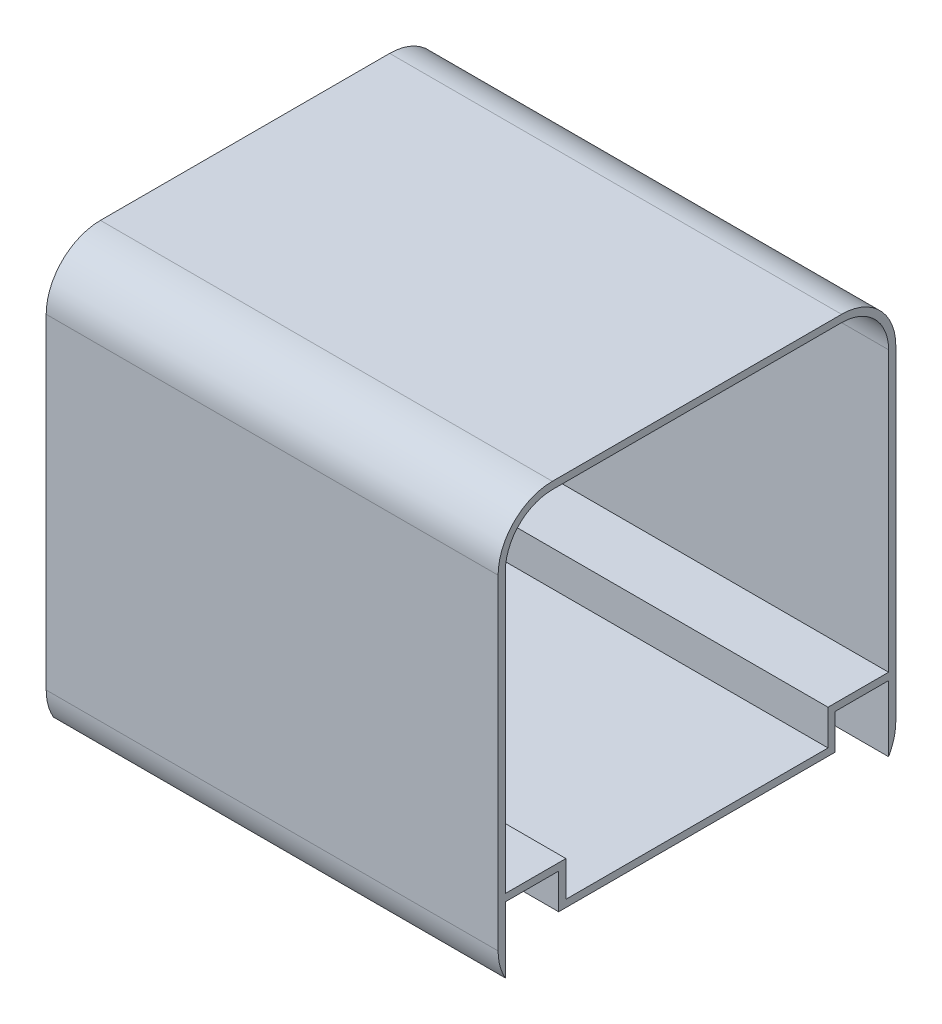
ISO-10303-21;
HEADER;
FILE_DESCRIPTION(('STEP AP214'),'2;1');
FILE_NAME('part.step','',(''),(''),'','','');
FILE_SCHEMA(('AUTOMOTIVE_DESIGN { 1 0 10303 214 1 1 1 1 }'));
ENDSEC;
DATA;
#1=APPLICATION_CONTEXT('core data for automotive mechanical design processes');
#2=APPLICATION_PROTOCOL_DEFINITION('international standard','automotive_design',2000,#1);
#3=PRODUCT_CONTEXT('',#1,'mechanical');
#4=PRODUCT('Part','Part','',(#3));
#5=PRODUCT_RELATED_PRODUCT_CATEGORY('part','',(#4));
#6=PRODUCT_DEFINITION_FORMATION('','',#4);
#7=PRODUCT_DEFINITION_CONTEXT('part definition',#1,'design');
#8=PRODUCT_DEFINITION('design','',#6,#7);
#9=PRODUCT_DEFINITION_SHAPE('','',#8);
#10=(LENGTH_UNIT() NAMED_UNIT(*) SI_UNIT(.MILLI.,.METRE.));
#11=(NAMED_UNIT(*) PLANE_ANGLE_UNIT() SI_UNIT($,.RADIAN.));
#12=(NAMED_UNIT(*) SI_UNIT($,.STERADIAN.) SOLID_ANGLE_UNIT());
#13=UNCERTAINTY_MEASURE_WITH_UNIT(LENGTH_MEASURE(1.E-05),#10,'distance_accuracy_value','');
#14=(GEOMETRIC_REPRESENTATION_CONTEXT(3) GLOBAL_UNCERTAINTY_ASSIGNED_CONTEXT((#13)) GLOBAL_UNIT_ASSIGNED_CONTEXT((#10,
#11,#12)) REPRESENTATION_CONTEXT('',''));
#15=CARTESIAN_POINT('',(0.,0.,0.));
#16=DIRECTION('',(0.,0.,1.));
#17=DIRECTION('',(1.,0.,0.));
#18=AXIS2_PLACEMENT_3D('',#15,#16,#17);
#19=CARTESIAN_POINT('',(3600.,1388.01094476767,-1100.));
#20=DIRECTION('',(-1.,0.,0.));
#21=DIRECTION('',(0.,0.,1.));
#22=AXIS2_PLACEMENT_3D('',#19,#20,#21);
#23=PLANE('',#22);
#24=CARTESIAN_POINT('',(3600.,900.,-800.));
#25=DIRECTION('',(-1.,0.,0.));
#26=DIRECTION('',(0.,0.,1.));
#27=AXIS2_PLACEMENT_3D('',#24,#25,#26);
#28=CIRCLE('',#27,300.);
#29=CARTESIAN_POINT('',(3600.,900.,-1100.));
#30=VERTEX_POINT('',#29);
#31=CARTESIAN_POINT('',(3600.,1200.,-800.));
#32=VERTEX_POINT('',#31);
#33=EDGE_CURVE('E283',#30,#32,#28,.F.);
#34=ORIENTED_EDGE('',*,*,#33,.F.);
#35=DIRECTION('',(0.,-1.,0.));
#36=VECTOR('',#35,1.);
#37=CARTESIAN_POINT('',(3600.,1200.,-1100.));
#38=LINE('',#37,#36);
#39=CARTESIAN_POINT('',(3600.,-900.,-1100.));
#40=VERTEX_POINT('',#39);
#41=EDGE_CURVE('E264',#30,#40,#38,.T.);
#42=ORIENTED_EDGE('',*,*,#41,.T.);
#43=CARTESIAN_POINT('',(3600.,-900.,-800.));
#44=DIRECTION('',(-1.,0.,0.));
#45=DIRECTION('',(0.,0.,1.));
#46=AXIS2_PLACEMENT_3D('',#43,#44,#45);
#47=CIRCLE('',#46,300.);
#48=CARTESIAN_POINT('',(3600.,-1049.66629547096,-1060.));
#49=VERTEX_POINT('',#48);
#50=EDGE_CURVE('E280',#49,#40,#47,.F.);
#51=ORIENTED_EDGE('',*,*,#50,.F.);
#52=DIRECTION('',(0.,-1.,0.));
#53=VECTOR('',#52,1.);
#54=CARTESIAN_POINT('',(3600.,1200.,-1060.));
#55=LINE('',#54,#53);
#56=CARTESIAN_POINT('',(3600.,-684.8,-1060.));
#57=VERTEX_POINT('',#56);
#58=EDGE_CURVE('E277',#57,#49,#55,.T.);
#59=ORIENTED_EDGE('',*,*,#58,.F.);
#60=DIRECTION('',(0.,0.,-1.));
#61=VECTOR('',#60,1.);
#62=CARTESIAN_POINT('',(3600.,-684.8,-2.26949470824867E-13));
#63=LINE('',#62,#61);
#64=CARTESIAN_POINT('',(3600.,-684.8,-764.999999999999));
#65=VERTEX_POINT('',#64);
#66=EDGE_CURVE('E39',#65,#57,#63,.T.);
#67=ORIENTED_EDGE('',*,*,#66,.F.);
#68=DIRECTION('',(0.,-1.,0.));
#69=VECTOR('',#68,1.);
#70=CARTESIAN_POINT('',(3600.,-1200.,-764.999999999999));
#71=LINE('',#70,#69);
#72=CARTESIAN_POINT('',(3600.,-880.,-764.999999999999));
#73=VERTEX_POINT('',#72);
#74=EDGE_CURVE('E242',#65,#73,#71,.T.);
#75=ORIENTED_EDGE('',*,*,#74,.T.);
#76=DIRECTION('',(0.,0.,-1.));
#77=VECTOR('',#76,1.);
#78=CARTESIAN_POINT('',(3600.,-880.,-1060.));
#79=LINE('',#78,#77);
#80=CARTESIAN_POINT('',(3600.,-880.,765.000000000001));
#81=VERTEX_POINT('',#80);
#82=EDGE_CURVE('E292',#81,#73,#79,.T.);
#83=ORIENTED_EDGE('',*,*,#82,.F.);
#84=DIRECTION('',(0.,1.,0.));
#85=VECTOR('',#84,1.);
#86=CARTESIAN_POINT('',(3600.,-1200.,765.000000000001));
#87=LINE('',#86,#85);
#88=CARTESIAN_POINT('',(3600.,-684.8,765.));
#89=VERTEX_POINT('',#88);
#90=EDGE_CURVE('E246',#81,#89,#87,.T.);
#91=ORIENTED_EDGE('',*,*,#90,.T.);
#92=DIRECTION('',(0.,0.,1.));
#93=VECTOR('',#92,1.);
#94=CARTESIAN_POINT('',(3600.,-684.8,-2.26949470824868E-13));
#95=LINE('',#94,#93);
#96=CARTESIAN_POINT('',(3600.,-684.8,1060.));
#97=VERTEX_POINT('',#96);
#98=EDGE_CURVE('E232',#89,#97,#95,.T.);
#99=ORIENTED_EDGE('',*,*,#98,.T.);
#100=DIRECTION('',(0.,1.,0.));
#101=VECTOR('',#100,1.);
#102=CARTESIAN_POINT('',(3600.,1200.,1060.));
#103=LINE('',#102,#101);
#104=CARTESIAN_POINT('',(3600.,-1049.66629547096,1060.));
#105=VERTEX_POINT('',#104);
#106=EDGE_CURVE('E269',#105,#97,#103,.T.);
#107=ORIENTED_EDGE('',*,*,#106,.F.);
#108=CARTESIAN_POINT('',(3600.,-900.,800.));
#109=DIRECTION('',(-1.,0.,0.));
#110=DIRECTION('',(0.,0.,1.));
#111=AXIS2_PLACEMENT_3D('',#108,#109,#110);
#112=CIRCLE('',#111,300.);
#113=CARTESIAN_POINT('',(3600.,-900.,1100.));
#114=VERTEX_POINT('',#113);
#115=EDGE_CURVE('E286',#114,#105,#112,.F.);
#116=ORIENTED_EDGE('',*,*,#115,.F.);
#117=DIRECTION('',(0.,1.,0.));
#118=VECTOR('',#117,1.);
#119=CARTESIAN_POINT('',(3600.,1200.,1100.));
#120=LINE('',#119,#118);
#121=CARTESIAN_POINT('',(3600.,900.,1100.));
#122=VERTEX_POINT('',#121);
#123=EDGE_CURVE('E260',#114,#122,#120,.T.);
#124=ORIENTED_EDGE('',*,*,#123,.T.);
#125=CARTESIAN_POINT('',(3600.,900.,800.));
#126=DIRECTION('',(-1.,0.,0.));
#127=DIRECTION('',(0.,0.,1.));
#128=AXIS2_PLACEMENT_3D('',#125,#126,#127);
#129=CIRCLE('',#128,300.);
#130=CARTESIAN_POINT('',(3600.,1200.,800.));
#131=VERTEX_POINT('',#130);
#132=EDGE_CURVE('E289',#131,#122,#129,.F.);
#133=ORIENTED_EDGE('',*,*,#132,.F.);
#134=DIRECTION('',(0.,0.,-1.));
#135=VECTOR('',#134,1.);
#136=CARTESIAN_POINT('',(3600.,1200.,1100.));
#137=LINE('',#136,#135);
#138=EDGE_CURVE('E256',#131,#32,#137,.T.);
#139=ORIENTED_EDGE('',*,*,#138,.T.);
#140=EDGE_LOOP('',(#34,#42,#51,#59,#67,#75,#83,#91,#99,#107,#116,#124,#133,#139));
#141=FACE_BOUND('',#140,.T.);
#142=DIRECTION('',(0.,1.,0.));
#143=VECTOR('',#142,1.);
#144=CARTESIAN_POINT('',(3600.,1200.,1060.));
#145=LINE('',#144,#143);
#146=CARTESIAN_POINT('',(3600.,-644.8,1060.));
#147=VERTEX_POINT('',#146);
#148=CARTESIAN_POINT('',(3600.,900.,1060.));
#149=VERTEX_POINT('',#148);
#150=EDGE_CURVE('E221',#147,#149,#145,.T.);
#151=ORIENTED_EDGE('',*,*,#150,.F.);
#152=DIRECTION('',(0.,0.,1.));
#153=VECTOR('',#152,1.);
#154=CARTESIAN_POINT('',(3600.,-644.8,-2.24854710401047E-13));
#155=LINE('',#154,#153);
#156=CARTESIAN_POINT('',(3600.,-644.8,725.000000000001));
#157=VERTEX_POINT('',#156);
#158=EDGE_CURVE('E300',#157,#147,#155,.T.);
#159=ORIENTED_EDGE('',*,*,#158,.F.);
#160=DIRECTION('',(0.,-1.,0.));
#161=VECTOR('',#160,1.);
#162=CARTESIAN_POINT('',(3600.,-684.8,725.000000000001));
#163=LINE('',#162,#161);
#164=CARTESIAN_POINT('',(3600.,-840.,725.000000000001));
#165=VERTEX_POINT('',#164);
#166=EDGE_CURVE('E239',#157,#165,#163,.T.);
#167=ORIENTED_EDGE('',*,*,#166,.T.);
#168=DIRECTION('',(0.,0.,1.));
#169=VECTOR('',#168,1.);
#170=CARTESIAN_POINT('',(3600.,-840.,-1060.));
#171=LINE('',#170,#169);
#172=CARTESIAN_POINT('',(3600.,-840.,-724.999999999999));
#173=VERTEX_POINT('',#172);
#174=EDGE_CURVE('E273',#173,#165,#171,.T.);
#175=ORIENTED_EDGE('',*,*,#174,.F.);
#176=DIRECTION('',(0.,1.,0.));
#177=VECTOR('',#176,1.);
#178=CARTESIAN_POINT('',(3600.,-684.8,-724.999999999999));
#179=LINE('',#178,#177);
#180=CARTESIAN_POINT('',(3600.,-644.8,-724.999999999999));
#181=VERTEX_POINT('',#180);
#182=EDGE_CURVE('E235',#173,#181,#179,.T.);
#183=ORIENTED_EDGE('',*,*,#182,.T.);
#184=DIRECTION('',(0.,0.,-1.));
#185=VECTOR('',#184,1.);
#186=CARTESIAN_POINT('',(3600.,-644.8,-2.24854710401046E-13));
#187=LINE('',#186,#185);
#188=CARTESIAN_POINT('',(3600.,-644.8,-1060.));
#189=VERTEX_POINT('',#188);
#190=EDGE_CURVE('E225',#181,#189,#187,.T.);
#191=ORIENTED_EDGE('',*,*,#190,.T.);
#192=DIRECTION('',(0.,-1.,0.));
#193=VECTOR('',#192,1.);
#194=CARTESIAN_POINT('',(3600.,1200.,-1060.));
#195=LINE('',#194,#193);
#196=CARTESIAN_POINT('',(3600.,900.,-1060.));
#197=VERTEX_POINT('',#196);
#198=EDGE_CURVE('E205',#197,#189,#195,.T.);
#199=ORIENTED_EDGE('',*,*,#198,.F.);
#200=CARTESIAN_POINT('',(3600.,900.,-800.));
#201=DIRECTION('',(-1.,0.,0.));
#202=DIRECTION('',(0.,0.,1.));
#203=AXIS2_PLACEMENT_3D('',#200,#201,#202);
#204=CIRCLE('',#203,260.);
#205=CARTESIAN_POINT('',(3600.,1160.,-800.));
#206=VERTEX_POINT('',#205);
#207=EDGE_CURVE('E252',#197,#206,#204,.F.);
#208=ORIENTED_EDGE('',*,*,#207,.T.);
#209=DIRECTION('',(0.,0.,-1.));
#210=VECTOR('',#209,1.);
#211=CARTESIAN_POINT('',(3600.,1160.,1100.));
#212=LINE('',#211,#210);
#213=CARTESIAN_POINT('',(3600.,1160.,800.));
#214=VERTEX_POINT('',#213);
#215=EDGE_CURVE('E296',#214,#206,#212,.T.);
#216=ORIENTED_EDGE('',*,*,#215,.F.);
#217=CARTESIAN_POINT('',(3600.,900.,800.));
#218=DIRECTION('',(-1.,0.,0.));
#219=DIRECTION('',(0.,0.,1.));
#220=AXIS2_PLACEMENT_3D('',#217,#218,#219);
#221=CIRCLE('',#220,260.);
#222=EDGE_CURVE('E250',#214,#149,#221,.F.);
#223=ORIENTED_EDGE('',*,*,#222,.T.);
#224=EDGE_LOOP('',(#151,#159,#167,#175,#183,#191,#199,#208,#216,#223));
#225=FACE_BOUND('',#224,.T.);
#226=ADVANCED_FACE('F35',(#141,#225),#23,.T.);
#227=CARTESIAN_POINT('',(6100.,1388.01094476767,-1100.));
#228=DIRECTION('',(1.,0.,0.));
#229=DIRECTION('',(0.,0.,-1.));
#230=AXIS2_PLACEMENT_3D('',#227,#228,#229);
#231=PLANE('',#230);
#232=CARTESIAN_POINT('',(6100.,900.,-800.));
#233=DIRECTION('',(1.,0.,0.));
#234=DIRECTION('',(0.,0.,-1.));
#235=AXIS2_PLACEMENT_3D('',#232,#233,#234);
#236=CIRCLE('',#235,300.);
#237=CARTESIAN_POINT('',(6100.,1200.,-800.));
#238=VERTEX_POINT('',#237);
#239=CARTESIAN_POINT('',(6100.,900.,-1100.));
#240=VERTEX_POINT('',#239);
#241=EDGE_CURVE('E284',#238,#240,#236,.F.);
#242=ORIENTED_EDGE('',*,*,#241,.F.);
#243=DIRECTION('',(0.,0.,1.));
#244=VECTOR('',#243,1.);
#245=CARTESIAN_POINT('',(6100.,1200.,1100.));
#246=LINE('',#245,#244);
#247=CARTESIAN_POINT('',(6100.,1200.,800.));
#248=VERTEX_POINT('',#247);
#249=EDGE_CURVE('E253',#238,#248,#246,.T.);
#250=ORIENTED_EDGE('',*,*,#249,.T.);
#251=CARTESIAN_POINT('',(6100.,900.,800.));
#252=DIRECTION('',(1.,0.,0.));
#253=DIRECTION('',(0.,0.,-1.));
#254=AXIS2_PLACEMENT_3D('',#251,#252,#253);
#255=CIRCLE('',#254,300.);
#256=CARTESIAN_POINT('',(6100.,900.,1100.));
#257=VERTEX_POINT('',#256);
#258=EDGE_CURVE('E290',#257,#248,#255,.F.);
#259=ORIENTED_EDGE('',*,*,#258,.F.);
#260=DIRECTION('',(0.,-1.,0.));
#261=VECTOR('',#260,1.);
#262=CARTESIAN_POINT('',(6100.,1200.,1100.));
#263=LINE('',#262,#261);
#264=CARTESIAN_POINT('',(6100.,-900.,1100.));
#265=VERTEX_POINT('',#264);
#266=EDGE_CURVE('E257',#257,#265,#263,.T.);
#267=ORIENTED_EDGE('',*,*,#266,.T.);
#268=CARTESIAN_POINT('',(6100.,-900.,800.));
#269=DIRECTION('',(1.,0.,0.));
#270=DIRECTION('',(0.,0.,-1.));
#271=AXIS2_PLACEMENT_3D('',#268,#269,#270);
#272=CIRCLE('',#271,300.);
#273=CARTESIAN_POINT('',(6100.,-1049.66629547096,1060.));
#274=VERTEX_POINT('',#273);
#275=EDGE_CURVE('E287',#274,#265,#272,.F.);
#276=ORIENTED_EDGE('',*,*,#275,.F.);
#277=DIRECTION('',(0.,-1.,0.));
#278=VECTOR('',#277,1.);
#279=CARTESIAN_POINT('',(6100.,1200.,1060.));
#280=LINE('',#279,#278);
#281=CARTESIAN_POINT('',(6100.,-684.8,1060.));
#282=VERTEX_POINT('',#281);
#283=EDGE_CURVE('E270',#282,#274,#280,.T.);
#284=ORIENTED_EDGE('',*,*,#283,.F.);
#285=DIRECTION('',(0.,0.,-1.));
#286=VECTOR('',#285,1.);
#287=CARTESIAN_POINT('',(6100.,-684.8,-2.26949470824868E-13));
#288=LINE('',#287,#286);
#289=CARTESIAN_POINT('',(6100.,-684.8,765.));
#290=VERTEX_POINT('',#289);
#291=EDGE_CURVE('E227',#282,#290,#288,.T.);
#292=ORIENTED_EDGE('',*,*,#291,.T.);
#293=DIRECTION('',(0.,-1.,0.));
#294=VECTOR('',#293,1.);
#295=CARTESIAN_POINT('',(6100.,-1200.,765.));
#296=LINE('',#295,#294);
#297=CARTESIAN_POINT('',(6100.,-880.,765.));
#298=VERTEX_POINT('',#297);
#299=EDGE_CURVE('E243',#290,#298,#296,.T.);
#300=ORIENTED_EDGE('',*,*,#299,.T.);
#301=DIRECTION('',(0.,0.,1.));
#302=VECTOR('',#301,1.);
#303=CARTESIAN_POINT('',(6100.,-880.,-1060.));
#304=LINE('',#303,#302);
#305=CARTESIAN_POINT('',(6100.,-880.,-765.));
#306=VERTEX_POINT('',#305);
#307=EDGE_CURVE('E293',#306,#298,#304,.T.);
#308=ORIENTED_EDGE('',*,*,#307,.F.);
#309=DIRECTION('',(0.,1.,0.));
#310=VECTOR('',#309,1.);
#311=CARTESIAN_POINT('',(6100.,-1200.,-765.));
#312=LINE('',#311,#310);
#313=CARTESIAN_POINT('',(6100.,-684.8,-765.));
#314=VERTEX_POINT('',#313);
#315=EDGE_CURVE('E240',#306,#314,#312,.T.);
#316=ORIENTED_EDGE('',*,*,#315,.T.);
#317=DIRECTION('',(0.,0.,1.));
#318=VECTOR('',#317,1.);
#319=CARTESIAN_POINT('',(6100.,-684.8,-2.26949470824867E-13));
#320=LINE('',#319,#318);
#321=CARTESIAN_POINT('',(6100.,-684.8,-1060.));
#322=VERTEX_POINT('',#321);
#323=EDGE_CURVE('E52',#322,#314,#320,.T.);
#324=ORIENTED_EDGE('',*,*,#323,.F.);
#325=DIRECTION('',(0.,1.,0.));
#326=VECTOR('',#325,1.);
#327=CARTESIAN_POINT('',(6100.,1200.,-1060.));
#328=LINE('',#327,#326);
#329=CARTESIAN_POINT('',(6100.,-1049.66629547096,-1060.));
#330=VERTEX_POINT('',#329);
#331=EDGE_CURVE('E278',#330,#322,#328,.T.);
#332=ORIENTED_EDGE('',*,*,#331,.F.);
#333=CARTESIAN_POINT('',(6100.,-900.,-800.));
#334=DIRECTION('',(1.,0.,0.));
#335=DIRECTION('',(0.,0.,-1.));
#336=AXIS2_PLACEMENT_3D('',#333,#334,#335);
#337=CIRCLE('',#336,300.);
#338=CARTESIAN_POINT('',(6100.,-900.,-1100.));
#339=VERTEX_POINT('',#338);
#340=EDGE_CURVE('E281',#339,#330,#337,.F.);
#341=ORIENTED_EDGE('',*,*,#340,.F.);
#342=DIRECTION('',(0.,1.,0.));
#343=VECTOR('',#342,1.);
#344=CARTESIAN_POINT('',(6100.,1200.,-1100.));
#345=LINE('',#344,#343);
#346=EDGE_CURVE('E261',#339,#240,#345,.T.);
#347=ORIENTED_EDGE('',*,*,#346,.T.);
#348=EDGE_LOOP('',(#242,#250,#259,#267,#276,#284,#292,#300,#308,#316,#324,#332,#341,#347));
#349=FACE_BOUND('',#348,.T.);
#350=DIRECTION('',(0.,-1.,0.));
#351=VECTOR('',#350,1.);
#352=CARTESIAN_POINT('',(6100.,1200.,1060.));
#353=LINE('',#352,#351);
#354=CARTESIAN_POINT('',(6100.,900.,1060.));
#355=VERTEX_POINT('',#354);
#356=CARTESIAN_POINT('',(6100.,-644.8,1060.));
#357=VERTEX_POINT('',#356);
#358=EDGE_CURVE('E266',#355,#357,#353,.T.);
#359=ORIENTED_EDGE('',*,*,#358,.F.);
#360=CARTESIAN_POINT('',(6100.,900.,800.));
#361=DIRECTION('',(1.,0.,0.));
#362=DIRECTION('',(0.,0.,-1.));
#363=AXIS2_PLACEMENT_3D('',#360,#361,#362);
#364=CIRCLE('',#363,260.);
#365=CARTESIAN_POINT('',(6100.,1160.,800.));
#366=VERTEX_POINT('',#365);
#367=EDGE_CURVE('E247',#355,#366,#364,.F.);
#368=ORIENTED_EDGE('',*,*,#367,.T.);
#369=DIRECTION('',(0.,0.,1.));
#370=VECTOR('',#369,1.);
#371=CARTESIAN_POINT('',(6100.,1160.,1100.));
#372=LINE('',#371,#370);
#373=CARTESIAN_POINT('',(6100.,1160.,-800.));
#374=VERTEX_POINT('',#373);
#375=EDGE_CURVE('E297',#374,#366,#372,.T.);
#376=ORIENTED_EDGE('',*,*,#375,.F.);
#377=CARTESIAN_POINT('',(6100.,900.,-800.));
#378=DIRECTION('',(1.,0.,0.));
#379=DIRECTION('',(0.,0.,-1.));
#380=AXIS2_PLACEMENT_3D('',#377,#378,#379);
#381=CIRCLE('',#380,260.);
#382=CARTESIAN_POINT('',(6100.,900.,-1060.));
#383=VERTEX_POINT('',#382);
#384=EDGE_CURVE('E220',#374,#383,#381,.F.);
#385=ORIENTED_EDGE('',*,*,#384,.T.);
#386=DIRECTION('',(0.,1.,0.));
#387=VECTOR('',#386,1.);
#388=CARTESIAN_POINT('',(6100.,1200.,-1060.));
#389=LINE('',#388,#387);
#390=CARTESIAN_POINT('',(6100.,-644.8,-1060.));
#391=VERTEX_POINT('',#390);
#392=EDGE_CURVE('E202',#391,#383,#389,.T.);
#393=ORIENTED_EDGE('',*,*,#392,.F.);
#394=DIRECTION('',(0.,0.,1.));
#395=VECTOR('',#394,1.);
#396=CARTESIAN_POINT('',(6100.,-644.8,-2.24854710401046E-13));
#397=LINE('',#396,#395);
#398=CARTESIAN_POINT('',(6100.,-644.8,-724.999999999999));
#399=VERTEX_POINT('',#398);
#400=EDGE_CURVE('E217',#391,#399,#397,.T.);
#401=ORIENTED_EDGE('',*,*,#400,.T.);
#402=DIRECTION('',(0.,-1.,0.));
#403=VECTOR('',#402,1.);
#404=CARTESIAN_POINT('',(6100.,-684.8,-725.));
#405=LINE('',#404,#403);
#406=CARTESIAN_POINT('',(6100.,-840.,-725.));
#407=VERTEX_POINT('',#406);
#408=EDGE_CURVE('E233',#399,#407,#405,.T.);
#409=ORIENTED_EDGE('',*,*,#408,.T.);
#410=DIRECTION('',(0.,0.,-1.));
#411=VECTOR('',#410,1.);
#412=CARTESIAN_POINT('',(6100.,-840.,-1060.));
#413=LINE('',#412,#411);
#414=CARTESIAN_POINT('',(6100.,-840.,725.));
#415=VERTEX_POINT('',#414);
#416=EDGE_CURVE('E274',#415,#407,#413,.T.);
#417=ORIENTED_EDGE('',*,*,#416,.F.);
#418=DIRECTION('',(0.,1.,0.));
#419=VECTOR('',#418,1.);
#420=CARTESIAN_POINT('',(6100.,-684.8,725.));
#421=LINE('',#420,#419);
#422=CARTESIAN_POINT('',(6100.,-644.8,725.000000000001));
#423=VERTEX_POINT('',#422);
#424=EDGE_CURVE('E236',#415,#423,#421,.T.);
#425=ORIENTED_EDGE('',*,*,#424,.T.);
#426=DIRECTION('',(0.,0.,-1.));
#427=VECTOR('',#426,1.);
#428=CARTESIAN_POINT('',(6100.,-644.8,-2.24854710401047E-13));
#429=LINE('',#428,#427);
#430=EDGE_CURVE('E301',#357,#423,#429,.T.);
#431=ORIENTED_EDGE('',*,*,#430,.F.);
#432=EDGE_LOOP('',(#359,#368,#376,#385,#393,#401,#409,#417,#425,#431));
#433=FACE_BOUND('',#432,.T.);
#434=ADVANCED_FACE('F215',(#349,#433),#231,.T.);
#435=CARTESIAN_POINT('',(-0.00199999999983547,-880.,-1060.));
#436=DIRECTION('',(0.,-1.,0.));
#437=DIRECTION('',(0.,0.,-1.));
#438=AXIS2_PLACEMENT_3D('',#435,#436,#437);
#439=PLANE('',#438);
#440=DIRECTION('',(1.,0.,0.));
#441=VECTOR('',#440,1.);
#442=CARTESIAN_POINT('',(-0.00199999999960947,-880.,765.000000000001));
#443=LINE('',#442,#441);
#444=EDGE_CURVE('E321',#81,#298,#443,.T.);
#445=ORIENTED_EDGE('',*,*,#444,.F.);
#446=ORIENTED_EDGE('',*,*,#82,.T.);
#447=DIRECTION('',(-1.,0.,0.));
#448=VECTOR('',#447,1.);
#449=CARTESIAN_POINT('',(-0.00199999999979894,-880.,-764.999999999999));
#450=LINE('',#449,#448);
#451=EDGE_CURVE('E329',#306,#73,#450,.T.);
#452=ORIENTED_EDGE('',*,*,#451,.F.);
#453=ORIENTED_EDGE('',*,*,#307,.T.);
#454=EDGE_LOOP('',(#445,#446,#452,#453));
#455=FACE_BOUND('',#454,.T.);
#456=ADVANCED_FACE('F435',(#455),#439,.T.);
#457=CARTESIAN_POINT('',(9000.,1200.,-1060.));
#458=DIRECTION('',(0.,0.,1.));
#459=DIRECTION('',(0.,-1.,0.));
#460=AXIS2_PLACEMENT_3D('',#457,#458,#459);
#461=PLANE('',#460);
#462=DIRECTION('',(-1.,0.,0.));
#463=VECTOR('',#462,1.);
#464=CARTESIAN_POINT('',(1060.,-684.8,-1060.));
#465=LINE('',#464,#463);
#466=EDGE_CURVE('E11',#322,#57,#465,.T.);
#467=ORIENTED_EDGE('',*,*,#466,.T.);
#468=ORIENTED_EDGE('',*,*,#58,.T.);
#469=DIRECTION('',(-1.,0.,0.));
#470=VECTOR('',#469,1.);
#471=CARTESIAN_POINT('',(9000.,-1049.66629547096,-1060.));
#472=LINE('',#471,#470);
#473=EDGE_CURVE('E326',#49,#330,#472,.F.);
#474=ORIENTED_EDGE('',*,*,#473,.T.);
#475=ORIENTED_EDGE('',*,*,#331,.T.);
#476=EDGE_LOOP('',(#467,#468,#474,#475));
#477=FACE_BOUND('',#476,.T.);
#478=ADVANCED_FACE('F429',(#477),#461,.T.);
#479=CARTESIAN_POINT('',(7375.78,-1200.,-765.));
#480=DIRECTION('',(0.,0.,1.));
#481=DIRECTION('',(1.,0.,0.));
#482=AXIS2_PLACEMENT_3D('',#479,#480,#481);
#483=PLANE('',#482);
#484=ORIENTED_EDGE('',*,*,#74,.F.);
#485=DIRECTION('',(-1.,0.,0.));
#486=VECTOR('',#485,1.);
#487=CARTESIAN_POINT('',(7375.78,-684.8,-765.));
#488=LINE('',#487,#486);
#489=EDGE_CURVE('E315',#314,#65,#488,.T.);
#490=ORIENTED_EDGE('',*,*,#489,.F.);
#491=ORIENTED_EDGE('',*,*,#315,.F.);
#492=ORIENTED_EDGE('',*,*,#451,.T.);
#493=EDGE_LOOP('',(#484,#490,#491,#492));
#494=FACE_BOUND('',#493,.T.);
#495=ADVANCED_FACE('F443',(#494),#483,.F.);
#496=CARTESIAN_POINT('',(0.,-684.8,-2.26949470824867E-13));
#497=DIRECTION('',(0.,-1.,0.));
#498=DIRECTION('',(0.,0.,-1.));
#499=AXIS2_PLACEMENT_3D('',#496,#497,#498);
#500=PLANE('',#499);
#501=ORIENTED_EDGE('',*,*,#489,.T.);
#502=ORIENTED_EDGE('',*,*,#66,.T.);
#503=ORIENTED_EDGE('',*,*,#466,.F.);
#504=ORIENTED_EDGE('',*,*,#323,.T.);
#505=EDGE_LOOP('',(#501,#502,#503,#504));
#506=FACE_BOUND('',#505,.T.);
#507=ADVANCED_FACE('F452',(#506),#500,.T.);
#508=CARTESIAN_POINT('',(9000.,1200.,1060.));
#509=DIRECTION('',(0.,0.,-1.));
#510=DIRECTION('',(0.,1.,0.));
#511=AXIS2_PLACEMENT_3D('',#508,#509,#510);
#512=PLANE('',#511);
#513=DIRECTION('',(-1.,0.,0.));
#514=VECTOR('',#513,1.);
#515=CARTESIAN_POINT('',(9000.,-1049.66629547096,1060.));
#516=LINE('',#515,#514);
#517=EDGE_CURVE('E323',#274,#105,#516,.T.);
#518=ORIENTED_EDGE('',*,*,#517,.T.);
#519=ORIENTED_EDGE('',*,*,#106,.T.);
#520=DIRECTION('',(1.,0.,0.));
#521=VECTOR('',#520,1.);
#522=CARTESIAN_POINT('',(1060.,-684.8,1060.));
#523=LINE('',#522,#521);
#524=EDGE_CURVE('E210',#97,#282,#523,.T.);
#525=ORIENTED_EDGE('',*,*,#524,.T.);
#526=ORIENTED_EDGE('',*,*,#283,.T.);
#527=EDGE_LOOP('',(#518,#519,#525,#526));
#528=FACE_BOUND('',#527,.T.);
#529=ADVANCED_FACE('F456',(#528),#512,.T.);
#530=CARTESIAN_POINT('',(7375.78,-1200.,765.));
#531=DIRECTION('',(0.,0.,-1.));
#532=DIRECTION('',(-1.,0.,0.));
#533=AXIS2_PLACEMENT_3D('',#530,#531,#532);
#534=PLANE('',#533);
#535=ORIENTED_EDGE('',*,*,#90,.F.);
#536=ORIENTED_EDGE('',*,*,#444,.T.);
#537=ORIENTED_EDGE('',*,*,#299,.F.);
#538=DIRECTION('',(1.,0.,0.));
#539=VECTOR('',#538,1.);
#540=CARTESIAN_POINT('',(1100.,-684.8,765.));
#541=LINE('',#540,#539);
#542=EDGE_CURVE('E319',#89,#290,#541,.T.);
#543=ORIENTED_EDGE('',*,*,#542,.F.);
#544=EDGE_LOOP('',(#535,#536,#537,#543));
#545=FACE_BOUND('',#544,.T.);
#546=ADVANCED_FACE('F464',(#545),#534,.F.);
#547=CARTESIAN_POINT('',(0.,-684.8,-2.26949470824868E-13));
#548=DIRECTION('',(0.,1.,0.));
#549=DIRECTION('',(0.,0.,1.));
#550=AXIS2_PLACEMENT_3D('',#547,#548,#549);
#551=PLANE('',#550);
#552=ORIENTED_EDGE('',*,*,#98,.F.);
#553=ORIENTED_EDGE('',*,*,#542,.T.);
#554=ORIENTED_EDGE('',*,*,#291,.F.);
#555=ORIENTED_EDGE('',*,*,#524,.F.);
#556=EDGE_LOOP('',(#552,#553,#554,#555));
#557=FACE_BOUND('',#556,.T.);
#558=ADVANCED_FACE('F467',(#557),#551,.F.);
#559=CARTESIAN_POINT('',(9000.,1200.,1100.));
#560=DIRECTION('',(0.,0.,-1.));
#561=DIRECTION('',(0.,1.,0.));
#562=AXIS2_PLACEMENT_3D('',#559,#560,#561);
#563=PLANE('',#562);
#564=ORIENTED_EDGE('',*,*,#123,.F.);
#565=DIRECTION('',(-1.,0.,0.));
#566=VECTOR('',#565,1.);
#567=CARTESIAN_POINT('',(9000.,-900.,1100.));
#568=LINE('',#567,#566);
#569=EDGE_CURVE('E342',#114,#265,#568,.F.);
#570=ORIENTED_EDGE('',*,*,#569,.T.);
#571=ORIENTED_EDGE('',*,*,#266,.F.);
#572=DIRECTION('',(-1.,0.,0.));
#573=VECTOR('',#572,1.);
#574=CARTESIAN_POINT('',(9000.,900.,1100.));
#575=LINE('',#574,#573);
#576=EDGE_CURVE('E339',#257,#122,#575,.T.);
#577=ORIENTED_EDGE('',*,*,#576,.T.);
#578=EDGE_LOOP('',(#564,#570,#571,#577));
#579=FACE_BOUND('',#578,.T.);
#580=ADVANCED_FACE('F471',(#579),#563,.F.);
#581=CARTESIAN_POINT('',(9000.,1200.,1100.));
#582=DIRECTION('',(0.,-1.,0.));
#583=DIRECTION('',(0.,0.,-1.));
#584=AXIS2_PLACEMENT_3D('',#581,#582,#583);
#585=PLANE('',#584);
#586=ORIENTED_EDGE('',*,*,#138,.F.);
#587=DIRECTION('',(-1.,0.,0.));
#588=VECTOR('',#587,1.);
#589=CARTESIAN_POINT('',(9000.,1200.,800.));
#590=LINE('',#589,#588);
#591=EDGE_CURVE('E351',#131,#248,#590,.F.);
#592=ORIENTED_EDGE('',*,*,#591,.T.);
#593=ORIENTED_EDGE('',*,*,#249,.F.);
#594=DIRECTION('',(-1.,0.,0.));
#595=VECTOR('',#594,1.);
#596=CARTESIAN_POINT('',(9000.,1200.,-800.));
#597=LINE('',#596,#595);
#598=EDGE_CURVE('E303',#238,#32,#597,.T.);
#599=ORIENTED_EDGE('',*,*,#598,.T.);
#600=EDGE_LOOP('',(#586,#592,#593,#599));
#601=FACE_BOUND('',#600,.T.);
#602=ADVANCED_FACE('F489',(#601),#585,.F.);
#603=CARTESIAN_POINT('',(9000.,900.,800.));
#604=DIRECTION('',(-1.,0.,0.));
#605=DIRECTION('',(0.,0.,1.));
#606=AXIS2_PLACEMENT_3D('',#603,#604,#605);
#607=CYLINDRICAL_SURFACE('',#606,300.);
#608=ORIENTED_EDGE('',*,*,#591,.F.);
#609=ORIENTED_EDGE('',*,*,#132,.T.);
#610=ORIENTED_EDGE('',*,*,#576,.F.);
#611=ORIENTED_EDGE('',*,*,#258,.T.);
#612=EDGE_LOOP('',(#608,#609,#610,#611));
#613=FACE_BOUND('',#612,.T.);
#614=ADVANCED_FACE('F447',(#613),#607,.T.);
#615=CARTESIAN_POINT('',(9000.,-900.,800.));
#616=DIRECTION('',(-1.,0.,0.));
#617=DIRECTION('',(0.,0.,1.));
#618=AXIS2_PLACEMENT_3D('',#615,#616,#617);
#619=CYLINDRICAL_SURFACE('',#618,300.);
#620=ORIENTED_EDGE('',*,*,#569,.F.);
#621=ORIENTED_EDGE('',*,*,#115,.T.);
#622=ORIENTED_EDGE('',*,*,#517,.F.);
#623=ORIENTED_EDGE('',*,*,#275,.T.);
#624=EDGE_LOOP('',(#620,#621,#622,#623));
#625=FACE_BOUND('',#624,.T.);
#626=ADVANCED_FACE('F457',(#625),#619,.T.);
#627=CARTESIAN_POINT('',(9000.,1200.,-1100.));
#628=DIRECTION('',(0.,0.,1.));
#629=DIRECTION('',(0.,-1.,0.));
#630=AXIS2_PLACEMENT_3D('',#627,#628,#629);
#631=PLANE('',#630);
#632=ORIENTED_EDGE('',*,*,#41,.F.);
#633=DIRECTION('',(-1.,0.,0.));
#634=VECTOR('',#633,1.);
#635=CARTESIAN_POINT('',(9000.,900.,-1100.));
#636=LINE('',#635,#634);
#637=EDGE_CURVE('E345',#30,#240,#636,.F.);
#638=ORIENTED_EDGE('',*,*,#637,.T.);
#639=ORIENTED_EDGE('',*,*,#346,.F.);
#640=DIRECTION('',(-1.,0.,0.));
#641=VECTOR('',#640,1.);
#642=CARTESIAN_POINT('',(9000.,-900.,-1100.));
#643=LINE('',#642,#641);
#644=EDGE_CURVE('E348',#339,#40,#643,.T.);
#645=ORIENTED_EDGE('',*,*,#644,.T.);
#646=EDGE_LOOP('',(#632,#638,#639,#645));
#647=FACE_BOUND('',#646,.T.);
#648=ADVANCED_FACE('F460',(#647),#631,.F.);
#649=CARTESIAN_POINT('',(9000.,900.,-800.));
#650=DIRECTION('',(-1.,0.,0.));
#651=DIRECTION('',(0.,0.,1.));
#652=AXIS2_PLACEMENT_3D('',#649,#650,#651);
#653=CYLINDRICAL_SURFACE('',#652,300.);
#654=ORIENTED_EDGE('',*,*,#637,.F.);
#655=ORIENTED_EDGE('',*,*,#33,.T.);
#656=ORIENTED_EDGE('',*,*,#598,.F.);
#657=ORIENTED_EDGE('',*,*,#241,.T.);
#658=EDGE_LOOP('',(#654,#655,#656,#657));
#659=FACE_BOUND('',#658,.T.);
#660=ADVANCED_FACE('F430',(#659),#653,.T.);
#661=CARTESIAN_POINT('',(9000.,-900.,-800.));
#662=DIRECTION('',(-1.,0.,0.));
#663=DIRECTION('',(0.,0.,1.));
#664=AXIS2_PLACEMENT_3D('',#661,#662,#663);
#665=CYLINDRICAL_SURFACE('',#664,300.);
#666=ORIENTED_EDGE('',*,*,#473,.F.);
#667=ORIENTED_EDGE('',*,*,#50,.T.);
#668=ORIENTED_EDGE('',*,*,#644,.F.);
#669=ORIENTED_EDGE('',*,*,#340,.T.);
#670=EDGE_LOOP('',(#666,#667,#668,#669));
#671=FACE_BOUND('',#670,.T.);
#672=ADVANCED_FACE('F422',(#671),#665,.T.);
#673=CARTESIAN_POINT('',(-0.00199999999983547,-840.,-1060.));
#674=DIRECTION('',(0.,1.,0.));
#675=DIRECTION('',(0.,0.,1.));
#676=AXIS2_PLACEMENT_3D('',#673,#674,#675);
#677=PLANE('',#676);
#678=DIRECTION('',(1.,0.,0.));
#679=VECTOR('',#678,1.);
#680=CARTESIAN_POINT('',(7415.78,-840.,-725.));
#681=LINE('',#680,#679);
#682=EDGE_CURVE('E313',#173,#407,#681,.T.);
#683=ORIENTED_EDGE('',*,*,#682,.F.);
#684=ORIENTED_EDGE('',*,*,#174,.T.);
#685=DIRECTION('',(-1.,0.,0.));
#686=VECTOR('',#685,1.);
#687=CARTESIAN_POINT('',(7415.78,-840.,725.));
#688=LINE('',#687,#686);
#689=EDGE_CURVE('E317',#415,#165,#688,.T.);
#690=ORIENTED_EDGE('',*,*,#689,.F.);
#691=ORIENTED_EDGE('',*,*,#416,.T.);
#692=EDGE_LOOP('',(#683,#684,#690,#691));
#693=FACE_BOUND('',#692,.T.);
#694=ADVANCED_FACE('F420',(#693),#677,.T.);
#695=DIRECTION('',(1.,0.,0.));
#696=VECTOR('',#695,1.);
#697=CARTESIAN_POINT('',(9000.,900.,-1060.));
#698=LINE('',#697,#696);
#699=EDGE_CURVE('E333',#197,#383,#698,.T.);
#700=ORIENTED_EDGE('',*,*,#699,.F.);
#701=ORIENTED_EDGE('',*,*,#198,.T.);
#702=DIRECTION('',(-1.,0.,0.));
#703=VECTOR('',#702,1.);
#704=CARTESIAN_POINT('',(1060.,-644.8,-1060.));
#705=LINE('',#704,#703);
#706=EDGE_CURVE('E199',#391,#189,#705,.T.);
#707=ORIENTED_EDGE('',*,*,#706,.F.);
#708=ORIENTED_EDGE('',*,*,#392,.T.);
#709=EDGE_LOOP('',(#700,#701,#707,#708));
#710=FACE_BOUND('',#709,.T.);
#711=ADVANCED_FACE('F201',(#710),#461,.T.);
#712=CARTESIAN_POINT('',(7415.78,-684.8,-725.));
#713=DIRECTION('',(0.,0.,-1.));
#714=DIRECTION('',(-1.,0.,0.));
#715=AXIS2_PLACEMENT_3D('',#712,#713,#714);
#716=PLANE('',#715);
#717=ORIENTED_EDGE('',*,*,#182,.F.);
#718=ORIENTED_EDGE('',*,*,#682,.T.);
#719=ORIENTED_EDGE('',*,*,#408,.F.);
#720=DIRECTION('',(1.,0.,0.));
#721=VECTOR('',#720,1.);
#722=CARTESIAN_POINT('',(1060.,-644.8,-724.999999999999));
#723=LINE('',#722,#721);
#724=EDGE_CURVE('E44',#181,#399,#723,.T.);
#725=ORIENTED_EDGE('',*,*,#724,.F.);
#726=EDGE_LOOP('',(#717,#718,#719,#725));
#727=FACE_BOUND('',#726,.T.);
#728=ADVANCED_FACE('F414',(#727),#716,.F.);
#729=CARTESIAN_POINT('',(0.,-644.8,-2.24854710401046E-13));
#730=DIRECTION('',(0.,-1.,0.));
#731=DIRECTION('',(0.,0.,-1.));
#732=AXIS2_PLACEMENT_3D('',#729,#730,#731);
#733=PLANE('',#732);
#734=ORIENTED_EDGE('',*,*,#190,.F.);
#735=ORIENTED_EDGE('',*,*,#724,.T.);
#736=ORIENTED_EDGE('',*,*,#400,.F.);
#737=ORIENTED_EDGE('',*,*,#706,.T.);
#738=EDGE_LOOP('',(#734,#735,#736,#737));
#739=FACE_BOUND('',#738,.T.);
#740=ADVANCED_FACE('F223',(#739),#733,.F.);
#741=DIRECTION('',(1.,0.,0.));
#742=VECTOR('',#741,1.);
#743=CARTESIAN_POINT('',(1060.,-644.8,1060.));
#744=LINE('',#743,#742);
#745=EDGE_CURVE('E307',#147,#357,#744,.T.);
#746=ORIENTED_EDGE('',*,*,#745,.F.);
#747=ORIENTED_EDGE('',*,*,#150,.T.);
#748=DIRECTION('',(1.,0.,0.));
#749=VECTOR('',#748,1.);
#750=CARTESIAN_POINT('',(9000.,900.,1060.));
#751=LINE('',#750,#749);
#752=EDGE_CURVE('E331',#355,#149,#751,.F.);
#753=ORIENTED_EDGE('',*,*,#752,.F.);
#754=ORIENTED_EDGE('',*,*,#358,.T.);
#755=EDGE_LOOP('',(#746,#747,#753,#754));
#756=FACE_BOUND('',#755,.T.);
#757=ADVANCED_FACE('F403',(#756),#512,.T.);
#758=CARTESIAN_POINT('',(7415.78,-684.8,725.));
#759=DIRECTION('',(0.,0.,1.));
#760=DIRECTION('',(1.,0.,0.));
#761=AXIS2_PLACEMENT_3D('',#758,#759,#760);
#762=PLANE('',#761);
#763=ORIENTED_EDGE('',*,*,#166,.F.);
#764=DIRECTION('',(-1.,0.,0.));
#765=VECTOR('',#764,1.);
#766=CARTESIAN_POINT('',(1060.,-644.8,725.000000000001));
#767=LINE('',#766,#765);
#768=EDGE_CURVE('E310',#423,#157,#767,.T.);
#769=ORIENTED_EDGE('',*,*,#768,.F.);
#770=ORIENTED_EDGE('',*,*,#424,.F.);
#771=ORIENTED_EDGE('',*,*,#689,.T.);
#772=EDGE_LOOP('',(#763,#769,#770,#771));
#773=FACE_BOUND('',#772,.T.);
#774=ADVANCED_FACE('F419',(#773),#762,.F.);
#775=CARTESIAN_POINT('',(0.,-644.8,-2.24854710401047E-13));
#776=DIRECTION('',(0.,1.,0.));
#777=DIRECTION('',(0.,0.,1.));
#778=AXIS2_PLACEMENT_3D('',#775,#776,#777);
#779=PLANE('',#778);
#780=ORIENTED_EDGE('',*,*,#768,.T.);
#781=ORIENTED_EDGE('',*,*,#158,.T.);
#782=ORIENTED_EDGE('',*,*,#745,.T.);
#783=ORIENTED_EDGE('',*,*,#430,.T.);
#784=EDGE_LOOP('',(#780,#781,#782,#783));
#785=FACE_BOUND('',#784,.T.);
#786=ADVANCED_FACE('F395',(#785),#779,.T.);
#787=CARTESIAN_POINT('',(9000.,1160.,1100.));
#788=DIRECTION('',(0.,-1.,0.));
#789=DIRECTION('',(0.,0.,-1.));
#790=AXIS2_PLACEMENT_3D('',#787,#788,#789);
#791=PLANE('',#790);
#792=DIRECTION('',(1.,0.,0.));
#793=VECTOR('',#792,1.);
#794=CARTESIAN_POINT('',(9000.,1160.,800.));
#795=LINE('',#794,#793);
#796=EDGE_CURVE('E335',#214,#366,#795,.T.);
#797=ORIENTED_EDGE('',*,*,#796,.F.);
#798=ORIENTED_EDGE('',*,*,#215,.T.);
#799=DIRECTION('',(1.,0.,0.));
#800=VECTOR('',#799,1.);
#801=CARTESIAN_POINT('',(9000.,1160.,-800.));
#802=LINE('',#801,#800);
#803=EDGE_CURVE('E337',#374,#206,#802,.F.);
#804=ORIENTED_EDGE('',*,*,#803,.F.);
#805=ORIENTED_EDGE('',*,*,#375,.T.);
#806=EDGE_LOOP('',(#797,#798,#804,#805));
#807=FACE_BOUND('',#806,.T.);
#808=ADVANCED_FACE('F408',(#807),#791,.T.);
#809=CARTESIAN_POINT('',(9000.,900.,800.));
#810=DIRECTION('',(-1.,0.,0.));
#811=DIRECTION('',(0.,0.,1.));
#812=AXIS2_PLACEMENT_3D('',#809,#810,#811);
#813=CYLINDRICAL_SURFACE('',#812,260.);
#814=ORIENTED_EDGE('',*,*,#222,.F.);
#815=ORIENTED_EDGE('',*,*,#796,.T.);
#816=ORIENTED_EDGE('',*,*,#367,.F.);
#817=ORIENTED_EDGE('',*,*,#752,.T.);
#818=EDGE_LOOP('',(#814,#815,#816,#817));
#819=FACE_BOUND('',#818,.T.);
#820=ADVANCED_FACE('F406',(#819),#813,.F.);
#821=CARTESIAN_POINT('',(9000.,900.,-800.));
#822=DIRECTION('',(-1.,0.,0.));
#823=DIRECTION('',(0.,0.,1.));
#824=AXIS2_PLACEMENT_3D('',#821,#822,#823);
#825=CYLINDRICAL_SURFACE('',#824,260.);
#826=ORIENTED_EDGE('',*,*,#207,.F.);
#827=ORIENTED_EDGE('',*,*,#699,.T.);
#828=ORIENTED_EDGE('',*,*,#384,.F.);
#829=ORIENTED_EDGE('',*,*,#803,.T.);
#830=EDGE_LOOP('',(#826,#827,#828,#829));
#831=FACE_BOUND('',#830,.T.);
#832=ADVANCED_FACE('F37',(#831),#825,.F.);
#833=CLOSED_SHELL('',(#226,#434,#456,#478,#495,#507,#529,#546,#558,#580,#602,#614,#626,#648,
#660,#672,#694,#711,#728,#740,#757,#774,#786,#808,#820,#832));
#834=MANIFOLD_SOLID_BREP('B2',#833);
#835=ADVANCED_BREP_SHAPE_REPRESENTATION('',(#18,#834),#14);
#836=SHAPE_DEFINITION_REPRESENTATION(#9,#835);
ENDSEC;
END-ISO-10303-21;
